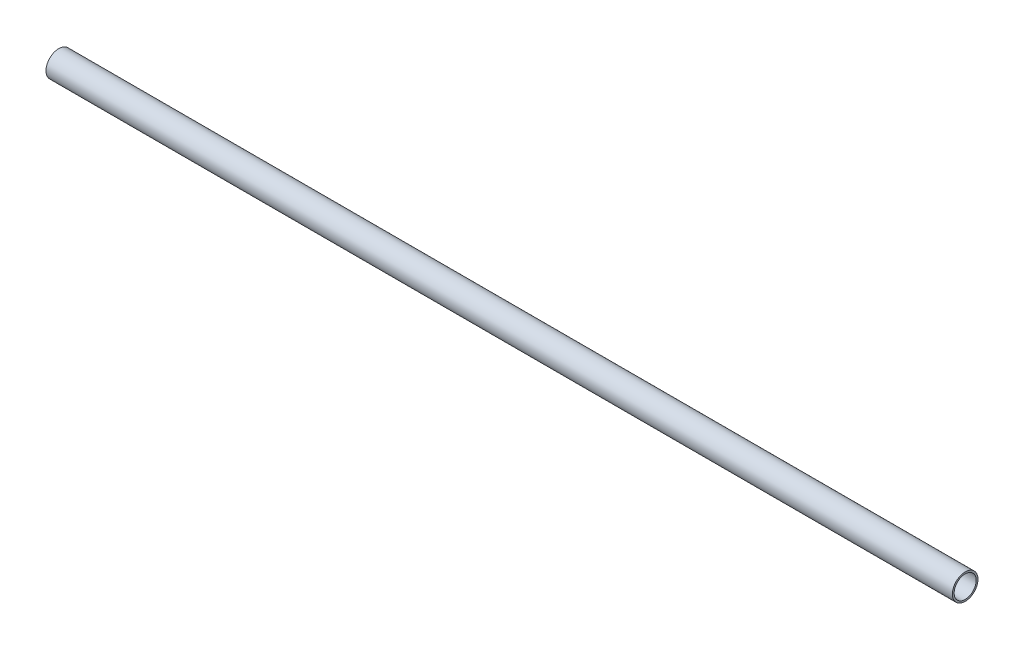
ISO-10303-21;
HEADER;
FILE_DESCRIPTION(('STEP AP214'),'2;1');
FILE_NAME('part.step','',(''),(''),'','','');
FILE_SCHEMA(('AUTOMOTIVE_DESIGN { 1 0 10303 214 1 1 1 1 }'));
ENDSEC;
DATA;
#1=APPLICATION_CONTEXT('core data for automotive mechanical design processes');
#2=APPLICATION_PROTOCOL_DEFINITION('international standard','automotive_design',2000,#1);
#3=PRODUCT_CONTEXT('',#1,'mechanical');
#4=PRODUCT('Part','Part','',(#3));
#5=PRODUCT_RELATED_PRODUCT_CATEGORY('part','',(#4));
#6=PRODUCT_DEFINITION_FORMATION('','',#4);
#7=PRODUCT_DEFINITION_CONTEXT('part definition',#1,'design');
#8=PRODUCT_DEFINITION('design','',#6,#7);
#9=PRODUCT_DEFINITION_SHAPE('','',#8);
#10=(LENGTH_UNIT() NAMED_UNIT(*) SI_UNIT(.MILLI.,.METRE.));
#11=(NAMED_UNIT(*) PLANE_ANGLE_UNIT() SI_UNIT($,.RADIAN.));
#12=(NAMED_UNIT(*) SI_UNIT($,.STERADIAN.) SOLID_ANGLE_UNIT());
#13=UNCERTAINTY_MEASURE_WITH_UNIT(LENGTH_MEASURE(1.E-05),#10,'distance_accuracy_value','');
#14=(GEOMETRIC_REPRESENTATION_CONTEXT(3) GLOBAL_UNCERTAINTY_ASSIGNED_CONTEXT((#13)) GLOBAL_UNIT_ASSIGNED_CONTEXT((#10,
#11,#12)) REPRESENTATION_CONTEXT('',''));
#15=CARTESIAN_POINT('',(0.,0.,0.));
#16=DIRECTION('',(0.,0.,1.));
#17=DIRECTION('',(1.,0.,0.));
#18=AXIS2_PLACEMENT_3D('',#15,#16,#17);
#19=CARTESIAN_POINT('',(2133.6,0.,0.));
#20=DIRECTION('',(1.,0.,0.));
#21=DIRECTION('',(0.,0.,-1.));
#22=AXIS2_PLACEMENT_3D('',#19,#20,#21);
#23=PLANE('',#22);
#24=CARTESIAN_POINT('',(2133.6,0.,0.));
#25=DIRECTION('',(1.,0.,0.));
#26=DIRECTION('',(0.,0.,-1.));
#27=AXIS2_PLACEMENT_3D('',#24,#25,#26);
#28=CIRCLE('',#27,30.1625);
#29=CARTESIAN_POINT('',(2133.6,0.,-30.1625));
#30=VERTEX_POINT('',#29);
#31=EDGE_CURVE('E10',#30,#30,#28,.T.);
#32=ORIENTED_EDGE('',*,*,#31,.T.);
#33=EDGE_LOOP('',(#32));
#34=FACE_BOUND('',#33,.T.);
#35=CARTESIAN_POINT('',(2133.6,0.,0.));
#36=DIRECTION('',(1.,0.,0.));
#37=DIRECTION('',(0.,0.,-1.));
#38=AXIS2_PLACEMENT_3D('',#35,#36,#37);
#39=CIRCLE('',#38,25.9969);
#40=CARTESIAN_POINT('',(2133.6,0.,-25.9969));
#41=VERTEX_POINT('',#40);
#42=EDGE_CURVE('E53',#41,#41,#39,.T.);
#43=ORIENTED_EDGE('',*,*,#42,.F.);
#44=EDGE_LOOP('',(#43));
#45=FACE_BOUND('',#44,.T.);
#46=ADVANCED_FACE('F39',(#34,#45),#23,.T.);
#47=CARTESIAN_POINT('',(0.,0.,0.));
#48=DIRECTION('',(1.,0.,0.));
#49=DIRECTION('',(0.,0.,-1.));
#50=AXIS2_PLACEMENT_3D('',#47,#48,#49);
#51=PLANE('',#50);
#52=CARTESIAN_POINT('',(0.,0.,0.));
#53=DIRECTION('',(1.,0.,0.));
#54=DIRECTION('',(0.,0.,-1.));
#55=AXIS2_PLACEMENT_3D('',#52,#53,#54);
#56=CIRCLE('',#55,30.1625);
#57=CARTESIAN_POINT('',(0.,0.,-30.1625));
#58=VERTEX_POINT('',#57);
#59=EDGE_CURVE('E43',#58,#58,#56,.T.);
#60=ORIENTED_EDGE('',*,*,#59,.F.);
#61=EDGE_LOOP('',(#60));
#62=FACE_BOUND('',#61,.T.);
#63=CARTESIAN_POINT('',(0.,0.,0.));
#64=DIRECTION('',(1.,0.,0.));
#65=DIRECTION('',(0.,0.,-1.));
#66=AXIS2_PLACEMENT_3D('',#63,#64,#65);
#67=CIRCLE('',#66,25.9969);
#68=CARTESIAN_POINT('',(0.,0.,-25.9969));
#69=VERTEX_POINT('',#68);
#70=EDGE_CURVE('E55',#69,#69,#67,.T.);
#71=ORIENTED_EDGE('',*,*,#70,.T.);
#72=EDGE_LOOP('',(#71));
#73=FACE_BOUND('',#72,.T.);
#74=ADVANCED_FACE('F68',(#62,#73),#51,.F.);
#75=CARTESIAN_POINT('',(2133.6,0.,0.));
#76=DIRECTION('',(-1.,0.,0.));
#77=DIRECTION('',(0.,0.,1.));
#78=AXIS2_PLACEMENT_3D('',#75,#76,#77);
#79=CYLINDRICAL_SURFACE('',#78,30.1625);
#80=ORIENTED_EDGE('',*,*,#31,.F.);
#81=EDGE_LOOP('',(#80));
#82=FACE_BOUND('',#81,.T.);
#83=ORIENTED_EDGE('',*,*,#59,.T.);
#84=EDGE_LOOP('',(#83));
#85=FACE_BOUND('',#84,.T.);
#86=ADVANCED_FACE('F41',(#82,#85),#79,.T.);
#87=CARTESIAN_POINT('',(2133.6,0.,0.));
#88=DIRECTION('',(-1.,0.,0.));
#89=DIRECTION('',(0.,0.,1.));
#90=AXIS2_PLACEMENT_3D('',#87,#88,#89);
#91=CYLINDRICAL_SURFACE('',#90,25.9969);
#92=ORIENTED_EDGE('',*,*,#42,.T.);
#93=EDGE_LOOP('',(#92));
#94=FACE_BOUND('',#93,.T.);
#95=ORIENTED_EDGE('',*,*,#70,.F.);
#96=EDGE_LOOP('',(#95));
#97=FACE_BOUND('',#96,.T.);
#98=ADVANCED_FACE('F64',(#94,#97),#91,.F.);
#99=CLOSED_SHELL('',(#46,#74,#86,#98));
#100=MANIFOLD_SOLID_BREP('B2',#99);
#101=ADVANCED_BREP_SHAPE_REPRESENTATION('',(#18,#100),#14);
#102=SHAPE_DEFINITION_REPRESENTATION(#9,#101);
ENDSEC;
END-ISO-10303-21;
